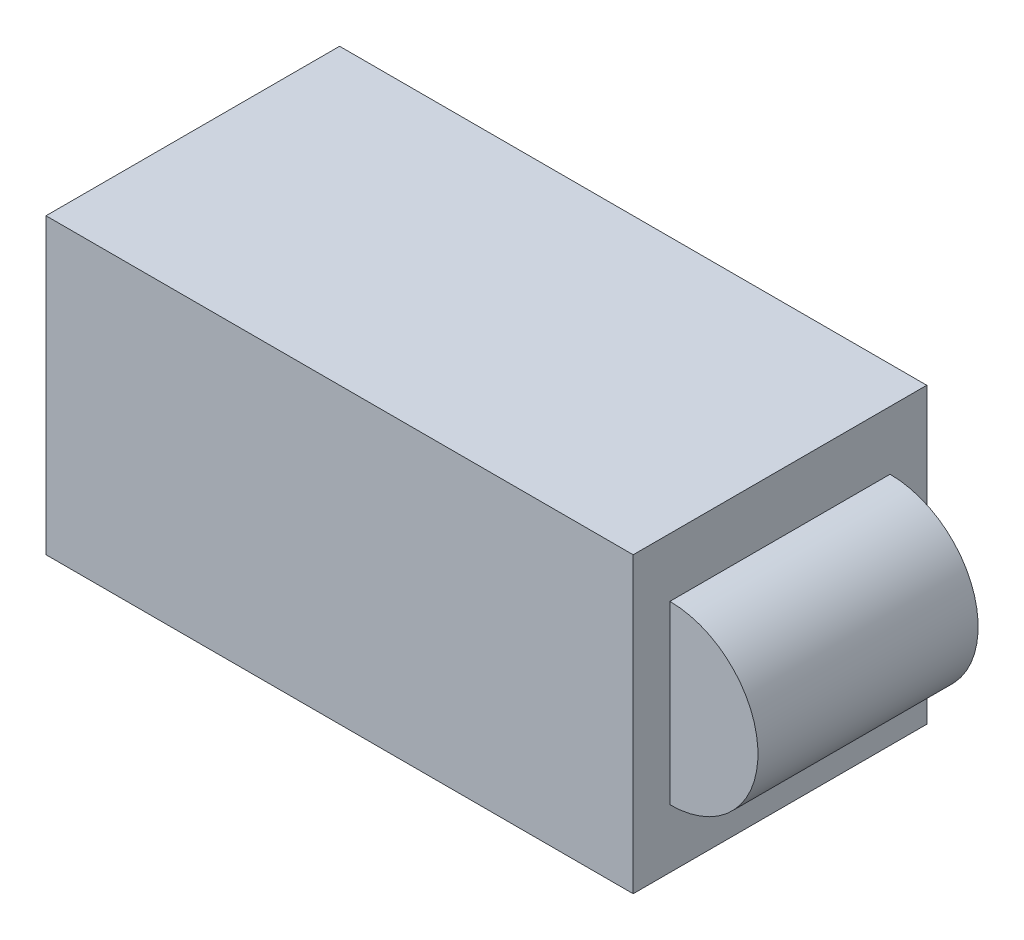
ISO-10303-21;
HEADER;
FILE_DESCRIPTION(('STEP AP214'),'2;1');
FILE_NAME('part.step','',(''),(''),'','','');
FILE_SCHEMA(('AUTOMOTIVE_DESIGN { 1 0 10303 214 1 1 1 1 }'));
ENDSEC;
DATA;
#1=APPLICATION_CONTEXT('core data for automotive mechanical design processes');
#2=APPLICATION_PROTOCOL_DEFINITION('international standard','automotive_design',2000,#1);
#3=PRODUCT_CONTEXT('',#1,'mechanical');
#4=PRODUCT('Part','Part','',(#3));
#5=PRODUCT_RELATED_PRODUCT_CATEGORY('part','',(#4));
#6=PRODUCT_DEFINITION_FORMATION('','',#4);
#7=PRODUCT_DEFINITION_CONTEXT('part definition',#1,'design');
#8=PRODUCT_DEFINITION('design','',#6,#7);
#9=PRODUCT_DEFINITION_SHAPE('','',#8);
#10=(LENGTH_UNIT() NAMED_UNIT(*) SI_UNIT(.MILLI.,.METRE.));
#11=(NAMED_UNIT(*) PLANE_ANGLE_UNIT() SI_UNIT($,.RADIAN.));
#12=(NAMED_UNIT(*) SI_UNIT($,.STERADIAN.) SOLID_ANGLE_UNIT());
#13=UNCERTAINTY_MEASURE_WITH_UNIT(LENGTH_MEASURE(1.E-05),#10,'distance_accuracy_value','');
#14=(GEOMETRIC_REPRESENTATION_CONTEXT(3) GLOBAL_UNCERTAINTY_ASSIGNED_CONTEXT((#13)) GLOBAL_UNIT_ASSIGNED_CONTEXT((#10,
#11,#12)) REPRESENTATION_CONTEXT('',''));
#15=CARTESIAN_POINT('',(0.,0.,0.));
#16=DIRECTION('',(0.,0.,1.));
#17=DIRECTION('',(1.,0.,0.));
#18=AXIS2_PLACEMENT_3D('',#15,#16,#17);
#19=CARTESIAN_POINT('',(0.,20.,10.));
#20=DIRECTION('',(1.,0.,0.));
#21=DIRECTION('',(0.,0.,-1.));
#22=AXIS2_PLACEMENT_3D('',#19,#20,#21);
#23=PLANE('',#22);
#24=DIRECTION('',(0.,-1.,0.));
#25=VECTOR('',#24,1.);
#26=CARTESIAN_POINT('',(0.,20.,-10.));
#27=LINE('',#26,#25);
#28=CARTESIAN_POINT('',(0.,20.,-10.));
#29=VERTEX_POINT('',#28);
#30=CARTESIAN_POINT('',(0.,0.,-10.));
#31=VERTEX_POINT('',#30);
#32=EDGE_CURVE('E103',#29,#31,#27,.T.);
#33=ORIENTED_EDGE('',*,*,#32,.T.);
#34=DIRECTION('',(0.,0.,-1.));
#35=VECTOR('',#34,1.);
#36=CARTESIAN_POINT('',(0.,0.,10.));
#37=LINE('',#36,#35);
#38=CARTESIAN_POINT('',(0.,0.,10.));
#39=VERTEX_POINT('',#38);
#40=EDGE_CURVE('E98',#39,#31,#37,.T.);
#41=ORIENTED_EDGE('',*,*,#40,.F.);
#42=DIRECTION('',(0.,-1.,0.));
#43=VECTOR('',#42,1.);
#44=CARTESIAN_POINT('',(0.,20.,10.));
#45=LINE('',#44,#43);
#46=CARTESIAN_POINT('',(0.,20.,10.));
#47=VERTEX_POINT('',#46);
#48=EDGE_CURVE('E106',#47,#39,#45,.T.);
#49=ORIENTED_EDGE('',*,*,#48,.F.);
#50=DIRECTION('',(0.,0.,-1.));
#51=VECTOR('',#50,1.);
#52=CARTESIAN_POINT('',(0.,20.,10.));
#53=LINE('',#52,#51);
#54=EDGE_CURVE('E116',#47,#29,#53,.T.);
#55=ORIENTED_EDGE('',*,*,#54,.T.);
#56=EDGE_LOOP('',(#33,#41,#49,#55));
#57=FACE_BOUND('',#56,.T.);
#58=ADVANCED_FACE('F41',(#57),#23,.F.);
#59=CARTESIAN_POINT('',(0.,0.,10.));
#60=DIRECTION('',(0.,1.,0.));
#61=DIRECTION('',(0.,0.,1.));
#62=AXIS2_PLACEMENT_3D('',#59,#60,#61);
#63=PLANE('',#62);
#64=DIRECTION('',(1.,0.,0.));
#65=VECTOR('',#64,1.);
#66=CARTESIAN_POINT('',(0.,0.,-10.));
#67=LINE('',#66,#65);
#68=CARTESIAN_POINT('',(40.,0.,-10.));
#69=VERTEX_POINT('',#68);
#70=EDGE_CURVE('E119',#31,#69,#67,.T.);
#71=ORIENTED_EDGE('',*,*,#70,.T.);
#72=DIRECTION('',(0.,0.,-1.));
#73=VECTOR('',#72,1.);
#74=CARTESIAN_POINT('',(40.,0.,10.));
#75=LINE('',#74,#73);
#76=CARTESIAN_POINT('',(40.,0.,10.));
#77=VERTEX_POINT('',#76);
#78=EDGE_CURVE('E129',#77,#69,#75,.T.);
#79=ORIENTED_EDGE('',*,*,#78,.F.);
#80=DIRECTION('',(1.,0.,0.));
#81=VECTOR('',#80,1.);
#82=CARTESIAN_POINT('',(0.,0.,10.));
#83=LINE('',#82,#81);
#84=EDGE_CURVE('E109',#39,#77,#83,.T.);
#85=ORIENTED_EDGE('',*,*,#84,.F.);
#86=ORIENTED_EDGE('',*,*,#40,.T.);
#87=EDGE_LOOP('',(#71,#79,#85,#86));
#88=FACE_BOUND('',#87,.T.);
#89=ADVANCED_FACE('F136',(#88),#63,.F.);
#90=CARTESIAN_POINT('',(40.,0.,10.));
#91=DIRECTION('',(-1.,0.,0.));
#92=DIRECTION('',(0.,0.,1.));
#93=AXIS2_PLACEMENT_3D('',#90,#91,#92);
#94=PLANE('',#93);
#95=DIRECTION('',(0.,0.,-1.));
#96=VECTOR('',#95,1.);
#97=CARTESIAN_POINT('',(40.,4.,7.5));
#98=LINE('',#97,#96);
#99=CARTESIAN_POINT('',(40.,4.,7.5));
#100=VERTEX_POINT('',#99);
#101=CARTESIAN_POINT('',(40.,4.,-7.5));
#102=VERTEX_POINT('',#101);
#103=EDGE_CURVE('E58',#100,#102,#98,.T.);
#104=ORIENTED_EDGE('',*,*,#103,.F.);
#105=DIRECTION('',(0.,1.,0.));
#106=VECTOR('',#105,1.);
#107=CARTESIAN_POINT('',(40.,0.,7.5));
#108=LINE('',#107,#106);
#109=CARTESIAN_POINT('',(40.,16.,7.5));
#110=VERTEX_POINT('',#109);
#111=EDGE_CURVE('E11',#100,#110,#108,.T.);
#112=ORIENTED_EDGE('',*,*,#111,.T.);
#113=DIRECTION('',(0.,0.,-1.));
#114=VECTOR('',#113,1.);
#115=CARTESIAN_POINT('',(40.,16.,7.5));
#116=LINE('',#115,#114);
#117=CARTESIAN_POINT('',(40.,16.,-7.5));
#118=VERTEX_POINT('',#117);
#119=EDGE_CURVE('E48',#118,#110,#116,.F.);
#120=ORIENTED_EDGE('',*,*,#119,.F.);
#121=DIRECTION('',(0.,1.,0.));
#122=VECTOR('',#121,1.);
#123=CARTESIAN_POINT('',(40.,0.,-7.5));
#124=LINE('',#123,#122);
#125=EDGE_CURVE('E89',#102,#118,#124,.T.);
#126=ORIENTED_EDGE('',*,*,#125,.F.);
#127=EDGE_LOOP('',(#104,#112,#120,#126));
#128=FACE_BOUND('',#127,.T.);
#129=DIRECTION('',(0.,1.,0.));
#130=VECTOR('',#129,1.);
#131=CARTESIAN_POINT('',(40.,0.,-10.));
#132=LINE('',#131,#130);
#133=CARTESIAN_POINT('',(40.,20.,-10.));
#134=VERTEX_POINT('',#133);
#135=EDGE_CURVE('E121',#69,#134,#132,.T.);
#136=ORIENTED_EDGE('',*,*,#135,.T.);
#137=DIRECTION('',(0.,0.,-1.));
#138=VECTOR('',#137,1.);
#139=CARTESIAN_POINT('',(40.,20.,10.));
#140=LINE('',#139,#138);
#141=CARTESIAN_POINT('',(40.,20.,10.));
#142=VERTEX_POINT('',#141);
#143=EDGE_CURVE('E126',#142,#134,#140,.T.);
#144=ORIENTED_EDGE('',*,*,#143,.F.);
#145=DIRECTION('',(0.,1.,0.));
#146=VECTOR('',#145,1.);
#147=CARTESIAN_POINT('',(40.,0.,10.));
#148=LINE('',#147,#146);
#149=EDGE_CURVE('E112',#77,#142,#148,.T.);
#150=ORIENTED_EDGE('',*,*,#149,.F.);
#151=ORIENTED_EDGE('',*,*,#78,.T.);
#152=EDGE_LOOP('',(#136,#144,#150,#151));
#153=FACE_BOUND('',#152,.T.);
#154=ADVANCED_FACE('F87',(#128,#153),#94,.F.);
#155=CARTESIAN_POINT('',(40.,20.,10.));
#156=DIRECTION('',(0.,-1.,0.));
#157=DIRECTION('',(0.,0.,-1.));
#158=AXIS2_PLACEMENT_3D('',#155,#156,#157);
#159=PLANE('',#158);
#160=DIRECTION('',(-1.,0.,0.));
#161=VECTOR('',#160,1.);
#162=CARTESIAN_POINT('',(40.,20.,-10.));
#163=LINE('',#162,#161);
#164=EDGE_CURVE('E110',#134,#29,#163,.T.);
#165=ORIENTED_EDGE('',*,*,#164,.T.);
#166=ORIENTED_EDGE('',*,*,#54,.F.);
#167=DIRECTION('',(-1.,0.,0.));
#168=VECTOR('',#167,1.);
#169=CARTESIAN_POINT('',(40.,20.,10.));
#170=LINE('',#169,#168);
#171=EDGE_CURVE('E114',#142,#47,#170,.T.);
#172=ORIENTED_EDGE('',*,*,#171,.F.);
#173=ORIENTED_EDGE('',*,*,#143,.T.);
#174=EDGE_LOOP('',(#165,#166,#172,#173));
#175=FACE_BOUND('',#174,.T.);
#176=ADVANCED_FACE('F150',(#175),#159,.F.);
#177=CARTESIAN_POINT('',(0.,0.,10.));
#178=DIRECTION('',(0.,0.,1.));
#179=DIRECTION('',(1.,0.,0.));
#180=AXIS2_PLACEMENT_3D('',#177,#178,#179);
#181=PLANE('',#180);
#182=ORIENTED_EDGE('',*,*,#48,.T.);
#183=ORIENTED_EDGE('',*,*,#84,.T.);
#184=ORIENTED_EDGE('',*,*,#149,.T.);
#185=ORIENTED_EDGE('',*,*,#171,.T.);
#186=EDGE_LOOP('',(#182,#183,#184,#185));
#187=FACE_BOUND('',#186,.T.);
#188=ADVANCED_FACE('F152',(#187),#181,.T.);
#189=CARTESIAN_POINT('',(0.,0.,-10.));
#190=DIRECTION('',(0.,0.,1.));
#191=DIRECTION('',(1.,0.,0.));
#192=AXIS2_PLACEMENT_3D('',#189,#190,#191);
#193=PLANE('',#192);
#194=ORIENTED_EDGE('',*,*,#32,.F.);
#195=ORIENTED_EDGE('',*,*,#164,.F.);
#196=ORIENTED_EDGE('',*,*,#135,.F.);
#197=ORIENTED_EDGE('',*,*,#70,.F.);
#198=EDGE_LOOP('',(#194,#195,#196,#197));
#199=FACE_BOUND('',#198,.T.);
#200=ADVANCED_FACE('F144',(#199),#193,.F.);
#201=CARTESIAN_POINT('',(40.,10.,7.5));
#202=DIRECTION('',(0.,0.,-1.));
#203=DIRECTION('',(-1.,0.,0.));
#204=AXIS2_PLACEMENT_3D('',#201,#202,#203);
#205=CYLINDRICAL_SURFACE('',#204,6.);
#206=CARTESIAN_POINT('',(40.,10.,-7.5));
#207=DIRECTION('',(0.,0.,1.));
#208=DIRECTION('',(1.,0.,0.));
#209=AXIS2_PLACEMENT_3D('',#206,#207,#208);
#210=CIRCLE('',#209,6.);
#211=EDGE_CURVE('E97',#102,#118,#210,.T.);
#212=ORIENTED_EDGE('',*,*,#211,.T.);
#213=ORIENTED_EDGE('',*,*,#119,.T.);
#214=CARTESIAN_POINT('',(40.,10.,7.5));
#215=DIRECTION('',(0.,0.,1.));
#216=DIRECTION('',(1.,0.,0.));
#217=AXIS2_PLACEMENT_3D('',#214,#215,#216);
#218=CIRCLE('',#217,6.);
#219=EDGE_CURVE('E101',#100,#110,#218,.T.);
#220=ORIENTED_EDGE('',*,*,#219,.F.);
#221=ORIENTED_EDGE('',*,*,#103,.T.);
#222=EDGE_LOOP('',(#212,#213,#220,#221));
#223=FACE_BOUND('',#222,.T.);
#224=ADVANCED_FACE('F100',(#223),#205,.T.);
#225=CARTESIAN_POINT('',(40.,10.,7.5));
#226=DIRECTION('',(0.,0.,1.));
#227=DIRECTION('',(1.,0.,0.));
#228=AXIS2_PLACEMENT_3D('',#225,#226,#227);
#229=PLANE('',#228);
#230=ORIENTED_EDGE('',*,*,#111,.F.);
#231=ORIENTED_EDGE('',*,*,#219,.T.);
#232=EDGE_LOOP('',(#230,#231));
#233=FACE_BOUND('',#232,.T.);
#234=ADVANCED_FACE('F182',(#233),#229,.T.);
#235=CARTESIAN_POINT('',(40.,10.,-7.5));
#236=DIRECTION('',(0.,0.,1.));
#237=DIRECTION('',(1.,0.,0.));
#238=AXIS2_PLACEMENT_3D('',#235,#236,#237);
#239=PLANE('',#238);
#240=ORIENTED_EDGE('',*,*,#211,.F.);
#241=ORIENTED_EDGE('',*,*,#125,.T.);
#242=EDGE_LOOP('',(#240,#241));
#243=FACE_BOUND('',#242,.T.);
#244=ADVANCED_FACE('F96',(#243),#239,.F.);
#245=CLOSED_SHELL('',(#58,#89,#154,#176,#188,#200,#224,#234,#244));
#246=MANIFOLD_SOLID_BREP('B2',#245);
#247=ADVANCED_BREP_SHAPE_REPRESENTATION('',(#18,#246),#14);
#248=SHAPE_DEFINITION_REPRESENTATION(#9,#247);
ENDSEC;
END-ISO-10303-21;
